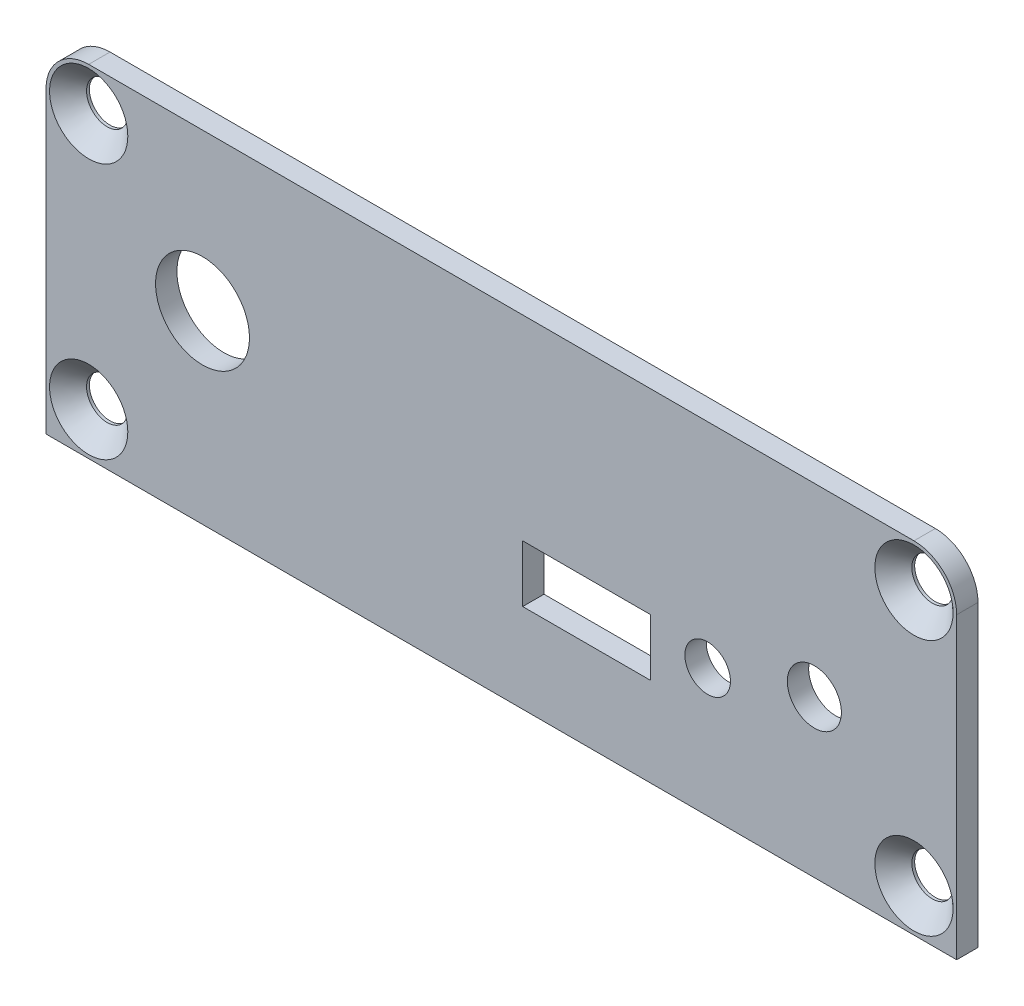
ISO-10303-21;
HEADER;
FILE_DESCRIPTION(('STEP AP214'),'2;1');
FILE_NAME('part.step','',(''),(''),'','','');
FILE_SCHEMA(('AUTOMOTIVE_DESIGN { 1 0 10303 214 1 1 1 1 }'));
ENDSEC;
DATA;
#1=APPLICATION_CONTEXT('core data for automotive mechanical design processes');
#2=APPLICATION_PROTOCOL_DEFINITION('international standard','automotive_design',2000,#1);
#3=PRODUCT_CONTEXT('',#1,'mechanical');
#4=PRODUCT('Part','Part','',(#3));
#5=PRODUCT_RELATED_PRODUCT_CATEGORY('part','',(#4));
#6=PRODUCT_DEFINITION_FORMATION('','',#4);
#7=PRODUCT_DEFINITION_CONTEXT('part definition',#1,'design');
#8=PRODUCT_DEFINITION('design','',#6,#7);
#9=PRODUCT_DEFINITION_SHAPE('','',#8);
#10=(LENGTH_UNIT() NAMED_UNIT(*) SI_UNIT(.MILLI.,.METRE.));
#11=(NAMED_UNIT(*) PLANE_ANGLE_UNIT() SI_UNIT($,.RADIAN.));
#12=(NAMED_UNIT(*) SI_UNIT($,.STERADIAN.) SOLID_ANGLE_UNIT());
#13=UNCERTAINTY_MEASURE_WITH_UNIT(LENGTH_MEASURE(1.E-05),#10,'distance_accuracy_value','');
#14=(GEOMETRIC_REPRESENTATION_CONTEXT(3) GLOBAL_UNCERTAINTY_ASSIGNED_CONTEXT((#13)) GLOBAL_UNIT_ASSIGNED_CONTEXT((#10,
#11,#12)) REPRESENTATION_CONTEXT('',''));
#15=CARTESIAN_POINT('',(0.,0.,0.));
#16=DIRECTION('',(0.,0.,1.));
#17=DIRECTION('',(1.,0.,0.));
#18=AXIS2_PLACEMENT_3D('',#15,#16,#17);
#19=CARTESIAN_POINT('',(32.,12.,-1.5));
#20=DIRECTION('',(1.,0.,0.));
#21=DIRECTION('',(0.,0.,-1.));
#22=AXIS2_PLACEMENT_3D('',#19,#20,#21);
#23=PLANE('',#22);
#24=DIRECTION('',(0.,1.,0.));
#25=VECTOR('',#24,1.);
#26=CARTESIAN_POINT('',(32.,12.,-1.5));
#27=LINE('',#26,#25);
#28=CARTESIAN_POINT('',(32.,-12.,-1.5));
#29=VERTEX_POINT('',#28);
#30=CARTESIAN_POINT('',(32.,9.,-1.5));
#31=VERTEX_POINT('',#30);
#32=EDGE_CURVE('E200',#29,#31,#27,.T.);
#33=ORIENTED_EDGE('',*,*,#32,.T.);
#34=DIRECTION('',(0.,0.,1.));
#35=VECTOR('',#34,1.);
#36=CARTESIAN_POINT('',(32.,9.,-1.5));
#37=LINE('',#36,#35);
#38=CARTESIAN_POINT('',(32.,9.,0.));
#39=VERTEX_POINT('',#38);
#40=EDGE_CURVE('E11',#31,#39,#37,.T.);
#41=ORIENTED_EDGE('',*,*,#40,.T.);
#42=DIRECTION('',(0.,1.,0.));
#43=VECTOR('',#42,1.);
#44=CARTESIAN_POINT('',(32.,12.,0.));
#45=LINE('',#44,#43);
#46=CARTESIAN_POINT('',(32.,-12.,0.));
#47=VERTEX_POINT('',#46);
#48=EDGE_CURVE('E199',#47,#39,#45,.T.);
#49=ORIENTED_EDGE('',*,*,#48,.F.);
#50=DIRECTION('',(0.,0.,1.));
#51=VECTOR('',#50,1.);
#52=CARTESIAN_POINT('',(32.,-12.,-1.5));
#53=LINE('',#52,#51);
#54=EDGE_CURVE('E222',#29,#47,#53,.T.);
#55=ORIENTED_EDGE('',*,*,#54,.F.);
#56=EDGE_LOOP('',(#33,#41,#49,#55));
#57=FACE_BOUND('',#56,.T.);
#58=ADVANCED_FACE('F32',(#57),#23,.T.);
#59=CARTESIAN_POINT('',(-32.,-12.,-1.5));
#60=DIRECTION('',(0.,-1.,0.));
#61=DIRECTION('',(0.,0.,-1.));
#62=AXIS2_PLACEMENT_3D('',#59,#60,#61);
#63=PLANE('',#62);
#64=DIRECTION('',(1.,0.,0.));
#65=VECTOR('',#64,1.);
#66=CARTESIAN_POINT('',(-32.,-12.,0.));
#67=LINE('',#66,#65);
#68=CARTESIAN_POINT('',(-32.,-12.,0.));
#69=VERTEX_POINT('',#68);
#70=EDGE_CURVE('E204',#69,#47,#67,.T.);
#71=ORIENTED_EDGE('',*,*,#70,.F.);
#72=DIRECTION('',(0.,0.,1.));
#73=VECTOR('',#72,1.);
#74=CARTESIAN_POINT('',(-32.,-12.,-1.5));
#75=LINE('',#74,#73);
#76=CARTESIAN_POINT('',(-32.,-12.,-1.5));
#77=VERTEX_POINT('',#76);
#78=EDGE_CURVE('E212',#77,#69,#75,.T.);
#79=ORIENTED_EDGE('',*,*,#78,.F.);
#80=DIRECTION('',(1.,0.,0.));
#81=VECTOR('',#80,1.);
#82=CARTESIAN_POINT('',(-32.,-12.,-1.5));
#83=LINE('',#82,#81);
#84=EDGE_CURVE('E209',#77,#29,#83,.T.);
#85=ORIENTED_EDGE('',*,*,#84,.T.);
#86=ORIENTED_EDGE('',*,*,#54,.T.);
#87=EDGE_LOOP('',(#71,#79,#85,#86));
#88=FACE_BOUND('',#87,.T.);
#89=ADVANCED_FACE('F260',(#88),#63,.T.);
#90=CARTESIAN_POINT('',(-32.,12.,-1.5));
#91=DIRECTION('',(-1.,0.,0.));
#92=DIRECTION('',(0.,0.,1.));
#93=AXIS2_PLACEMENT_3D('',#90,#91,#92);
#94=PLANE('',#93);
#95=DIRECTION('',(0.,-1.,0.));
#96=VECTOR('',#95,1.);
#97=CARTESIAN_POINT('',(-32.,12.,0.));
#98=LINE('',#97,#96);
#99=CARTESIAN_POINT('',(-32.,9.,0.));
#100=VERTEX_POINT('',#99);
#101=EDGE_CURVE('E218',#100,#69,#98,.T.);
#102=ORIENTED_EDGE('',*,*,#101,.F.);
#103=DIRECTION('',(0.,0.,1.));
#104=VECTOR('',#103,1.);
#105=CARTESIAN_POINT('',(-32.,9.,-1.5));
#106=LINE('',#105,#104);
#107=CARTESIAN_POINT('',(-32.,9.,-1.5));
#108=VERTEX_POINT('',#107);
#109=EDGE_CURVE('E235',#100,#108,#106,.F.);
#110=ORIENTED_EDGE('',*,*,#109,.T.);
#111=DIRECTION('',(0.,-1.,0.));
#112=VECTOR('',#111,1.);
#113=CARTESIAN_POINT('',(-32.,12.,-1.5));
#114=LINE('',#113,#112);
#115=EDGE_CURVE('E207',#108,#77,#114,.T.);
#116=ORIENTED_EDGE('',*,*,#115,.T.);
#117=ORIENTED_EDGE('',*,*,#78,.T.);
#118=EDGE_LOOP('',(#102,#110,#116,#117));
#119=FACE_BOUND('',#118,.T.);
#120=ADVANCED_FACE('F256',(#119),#94,.T.);
#121=CARTESIAN_POINT('',(-32.,12.,-1.5));
#122=DIRECTION('',(0.,1.,0.));
#123=DIRECTION('',(0.,0.,1.));
#124=AXIS2_PLACEMENT_3D('',#121,#122,#123);
#125=PLANE('',#124);
#126=DIRECTION('',(-1.,0.,0.));
#127=VECTOR('',#126,1.);
#128=CARTESIAN_POINT('',(-32.,12.,-1.5));
#129=LINE('',#128,#127);
#130=CARTESIAN_POINT('',(29.,12.,-1.5));
#131=VERTEX_POINT('',#130);
#132=CARTESIAN_POINT('',(-29.,12.,-1.5));
#133=VERTEX_POINT('',#132);
#134=EDGE_CURVE('E203',#131,#133,#129,.T.);
#135=ORIENTED_EDGE('',*,*,#134,.T.);
#136=DIRECTION('',(0.,0.,1.));
#137=VECTOR('',#136,1.);
#138=CARTESIAN_POINT('',(-29.,12.,-1.5));
#139=LINE('',#138,#137);
#140=CARTESIAN_POINT('',(-29.,12.,0.));
#141=VERTEX_POINT('',#140);
#142=EDGE_CURVE('E228',#133,#141,#139,.T.);
#143=ORIENTED_EDGE('',*,*,#142,.T.);
#144=DIRECTION('',(-1.,0.,0.));
#145=VECTOR('',#144,1.);
#146=CARTESIAN_POINT('',(-32.,12.,0.));
#147=LINE('',#146,#145);
#148=CARTESIAN_POINT('',(29.,12.,0.));
#149=VERTEX_POINT('',#148);
#150=EDGE_CURVE('E215',#149,#141,#147,.T.);
#151=ORIENTED_EDGE('',*,*,#150,.F.);
#152=DIRECTION('',(0.,0.,1.));
#153=VECTOR('',#152,1.);
#154=CARTESIAN_POINT('',(29.,12.,-1.5));
#155=LINE('',#154,#153);
#156=EDGE_CURVE('E224',#149,#131,#155,.F.);
#157=ORIENTED_EDGE('',*,*,#156,.T.);
#158=EDGE_LOOP('',(#135,#143,#151,#157));
#159=FACE_BOUND('',#158,.T.);
#160=ADVANCED_FACE('F248',(#159),#125,.T.);
#161=CARTESIAN_POINT('',(0.,0.,-1.5));
#162=DIRECTION('',(0.,0.,1.));
#163=DIRECTION('',(1.,0.,0.));
#164=AXIS2_PLACEMENT_3D('',#161,#162,#163);
#165=PLANE('',#164);
#166=DIRECTION('',(1.,0.,0.));
#167=VECTOR('',#166,1.);
#168=CARTESIAN_POINT('',(1.5,-5.75,-1.5));
#169=LINE('',#168,#167);
#170=CARTESIAN_POINT('',(1.5,-5.75,-1.5));
#171=VERTEX_POINT('',#170);
#172=CARTESIAN_POINT('',(10.5,-5.75,-1.5));
#173=VERTEX_POINT('',#172);
#174=EDGE_CURVE('E117',#171,#173,#169,.T.);
#175=ORIENTED_EDGE('',*,*,#174,.T.);
#176=DIRECTION('',(0.,1.,0.));
#177=VECTOR('',#176,1.);
#178=CARTESIAN_POINT('',(10.5,-1.75,-1.5));
#179=LINE('',#178,#177);
#180=CARTESIAN_POINT('',(10.5,-1.75,-1.5));
#181=VERTEX_POINT('',#180);
#182=EDGE_CURVE('E111',#173,#181,#179,.T.);
#183=ORIENTED_EDGE('',*,*,#182,.T.);
#184=DIRECTION('',(-1.,0.,0.));
#185=VECTOR('',#184,1.);
#186=CARTESIAN_POINT('',(1.5,-1.75,-1.5));
#187=LINE('',#186,#185);
#188=CARTESIAN_POINT('',(1.5,-1.75,-1.5));
#189=VERTEX_POINT('',#188);
#190=EDGE_CURVE('E120',#181,#189,#187,.T.);
#191=ORIENTED_EDGE('',*,*,#190,.T.);
#192=DIRECTION('',(0.,-1.,0.));
#193=VECTOR('',#192,1.);
#194=CARTESIAN_POINT('',(1.5,-1.75,-1.5));
#195=LINE('',#194,#193);
#196=EDGE_CURVE('E47',#189,#171,#195,.T.);
#197=ORIENTED_EDGE('',*,*,#196,.T.);
#198=EDGE_LOOP('',(#175,#183,#191,#197));
#199=FACE_BOUND('',#198,.T.);
#200=CARTESIAN_POINT('',(22.,-1.,-1.5));
#201=DIRECTION('',(0.,0.,1.));
#202=DIRECTION('',(1.,0.,0.));
#203=AXIS2_PLACEMENT_3D('',#200,#201,#202);
#204=CIRCLE('',#203,1.9);
#205=CARTESIAN_POINT('',(23.9,-1.,-1.5));
#206=VERTEX_POINT('',#205);
#207=EDGE_CURVE('E146',#206,#206,#204,.T.);
#208=ORIENTED_EDGE('',*,*,#207,.T.);
#209=EDGE_LOOP('',(#208));
#210=FACE_BOUND('',#209,.T.);
#211=CARTESIAN_POINT('',(14.5,-3.,-1.5));
#212=DIRECTION('',(0.,0.,1.));
#213=DIRECTION('',(1.,0.,0.));
#214=AXIS2_PLACEMENT_3D('',#211,#212,#213);
#215=CIRCLE('',#214,1.6);
#216=CARTESIAN_POINT('',(16.1,-3.,-1.5));
#217=VERTEX_POINT('',#216);
#218=EDGE_CURVE('E152',#217,#217,#215,.T.);
#219=ORIENTED_EDGE('',*,*,#218,.T.);
#220=EDGE_LOOP('',(#219));
#221=FACE_BOUND('',#220,.T.);
#222=CARTESIAN_POINT('',(-21.,1.,-1.5));
#223=DIRECTION('',(0.,0.,1.));
#224=DIRECTION('',(1.,0.,0.));
#225=AXIS2_PLACEMENT_3D('',#222,#223,#224);
#226=CIRCLE('',#225,3.3);
#227=CARTESIAN_POINT('',(-17.7,1.,-1.5));
#228=VERTEX_POINT('',#227);
#229=EDGE_CURVE('E158',#228,#228,#226,.T.);
#230=ORIENTED_EDGE('',*,*,#229,.T.);
#231=EDGE_LOOP('',(#230));
#232=FACE_BOUND('',#231,.T.);
#233=CARTESIAN_POINT('',(-29.,9.,-1.5));
#234=DIRECTION('',(0.,0.,1.));
#235=DIRECTION('',(1.,0.,0.));
#236=AXIS2_PLACEMENT_3D('',#233,#234,#235);
#237=CIRCLE('',#236,1.45);
#238=CARTESIAN_POINT('',(-27.55,9.,-1.5));
#239=VERTEX_POINT('',#238);
#240=EDGE_CURVE('E169',#239,#239,#237,.T.);
#241=ORIENTED_EDGE('',*,*,#240,.T.);
#242=EDGE_LOOP('',(#241));
#243=FACE_BOUND('',#242,.T.);
#244=CARTESIAN_POINT('',(29.,9.,-1.5));
#245=DIRECTION('',(0.,0.,1.));
#246=DIRECTION('',(1.,0.,0.));
#247=AXIS2_PLACEMENT_3D('',#244,#245,#246);
#248=CIRCLE('',#247,1.45);
#249=CARTESIAN_POINT('',(30.45,9.,-1.5));
#250=VERTEX_POINT('',#249);
#251=EDGE_CURVE('E178',#250,#250,#248,.T.);
#252=ORIENTED_EDGE('',*,*,#251,.T.);
#253=EDGE_LOOP('',(#252));
#254=FACE_BOUND('',#253,.T.);
#255=CARTESIAN_POINT('',(-29.,-9.,-1.5));
#256=DIRECTION('',(0.,0.,1.));
#257=DIRECTION('',(1.,0.,0.));
#258=AXIS2_PLACEMENT_3D('',#255,#256,#257);
#259=CIRCLE('',#258,1.45);
#260=CARTESIAN_POINT('',(-27.55,-9.,-1.5));
#261=VERTEX_POINT('',#260);
#262=EDGE_CURVE('E187',#261,#261,#259,.T.);
#263=ORIENTED_EDGE('',*,*,#262,.T.);
#264=EDGE_LOOP('',(#263));
#265=FACE_BOUND('',#264,.T.);
#266=CARTESIAN_POINT('',(29.,-9.,-1.5));
#267=DIRECTION('',(0.,0.,1.));
#268=DIRECTION('',(1.,0.,0.));
#269=AXIS2_PLACEMENT_3D('',#266,#267,#268);
#270=CIRCLE('',#269,1.45);
#271=CARTESIAN_POINT('',(30.45,-9.,-1.5));
#272=VERTEX_POINT('',#271);
#273=EDGE_CURVE('E196',#272,#272,#270,.T.);
#274=ORIENTED_EDGE('',*,*,#273,.T.);
#275=EDGE_LOOP('',(#274));
#276=FACE_BOUND('',#275,.T.);
#277=ORIENTED_EDGE('',*,*,#115,.F.);
#278=CARTESIAN_POINT('',(-29.,9.,-1.5));
#279=DIRECTION('',(0.,0.,1.));
#280=DIRECTION('',(1.,0.,0.));
#281=AXIS2_PLACEMENT_3D('',#278,#279,#280);
#282=CIRCLE('',#281,3.);
#283=EDGE_CURVE('E40',#108,#133,#282,.F.);
#284=ORIENTED_EDGE('',*,*,#283,.T.);
#285=ORIENTED_EDGE('',*,*,#134,.F.);
#286=CARTESIAN_POINT('',(29.,9.,-1.5));
#287=DIRECTION('',(0.,0.,1.));
#288=DIRECTION('',(1.,0.,0.));
#289=AXIS2_PLACEMENT_3D('',#286,#287,#288);
#290=CIRCLE('',#289,3.);
#291=EDGE_CURVE('E237',#131,#31,#290,.F.);
#292=ORIENTED_EDGE('',*,*,#291,.T.);
#293=ORIENTED_EDGE('',*,*,#32,.F.);
#294=ORIENTED_EDGE('',*,*,#84,.F.);
#295=EDGE_LOOP('',(#277,#284,#285,#292,#293,#294));
#296=FACE_BOUND('',#295,.T.);
#297=ADVANCED_FACE('F124',(#199,#210,#221,#232,#243,#254,#265,#276,#296),#165,.F.);
#298=CARTESIAN_POINT('',(0.,0.,0.));
#299=DIRECTION('',(0.,0.,1.));
#300=DIRECTION('',(1.,0.,0.));
#301=AXIS2_PLACEMENT_3D('',#298,#299,#300);
#302=PLANE('',#301);
#303=DIRECTION('',(0.,1.,0.));
#304=VECTOR('',#303,1.);
#305=CARTESIAN_POINT('',(10.5,-1.75,0.));
#306=LINE('',#305,#304);
#307=CARTESIAN_POINT('',(10.5,-5.75,0.));
#308=VERTEX_POINT('',#307);
#309=CARTESIAN_POINT('',(10.5,-1.75,0.));
#310=VERTEX_POINT('',#309);
#311=EDGE_CURVE('E55',#308,#310,#306,.T.);
#312=ORIENTED_EDGE('',*,*,#311,.F.);
#313=DIRECTION('',(1.,0.,0.));
#314=VECTOR('',#313,1.);
#315=CARTESIAN_POINT('',(1.5,-5.75,0.));
#316=LINE('',#315,#314);
#317=CARTESIAN_POINT('',(1.5,-5.75,0.));
#318=VERTEX_POINT('',#317);
#319=EDGE_CURVE('E127',#318,#308,#316,.T.);
#320=ORIENTED_EDGE('',*,*,#319,.F.);
#321=DIRECTION('',(0.,-1.,0.));
#322=VECTOR('',#321,1.);
#323=CARTESIAN_POINT('',(1.5,-1.75,0.));
#324=LINE('',#323,#322);
#325=CARTESIAN_POINT('',(1.5,-1.75,0.));
#326=VERTEX_POINT('',#325);
#327=EDGE_CURVE('E130',#326,#318,#324,.T.);
#328=ORIENTED_EDGE('',*,*,#327,.F.);
#329=DIRECTION('',(-1.,0.,0.));
#330=VECTOR('',#329,1.);
#331=CARTESIAN_POINT('',(1.5,-1.75,0.));
#332=LINE('',#331,#330);
#333=EDGE_CURVE('E136',#310,#326,#332,.T.);
#334=ORIENTED_EDGE('',*,*,#333,.F.);
#335=EDGE_LOOP('',(#312,#320,#328,#334));
#336=FACE_BOUND('',#335,.T.);
#337=CARTESIAN_POINT('',(22.,-1.,0.));
#338=DIRECTION('',(0.,0.,1.));
#339=DIRECTION('',(1.,0.,0.));
#340=AXIS2_PLACEMENT_3D('',#337,#338,#339);
#341=CIRCLE('',#340,1.9);
#342=CARTESIAN_POINT('',(23.9,-1.,0.));
#343=VERTEX_POINT('',#342);
#344=EDGE_CURVE('E142',#343,#343,#341,.T.);
#345=ORIENTED_EDGE('',*,*,#344,.F.);
#346=EDGE_LOOP('',(#345));
#347=FACE_BOUND('',#346,.T.);
#348=CARTESIAN_POINT('',(14.5,-3.,0.));
#349=DIRECTION('',(0.,0.,1.));
#350=DIRECTION('',(1.,0.,0.));
#351=AXIS2_PLACEMENT_3D('',#348,#349,#350);
#352=CIRCLE('',#351,1.6);
#353=CARTESIAN_POINT('',(16.1,-3.,0.));
#354=VERTEX_POINT('',#353);
#355=EDGE_CURVE('E149',#354,#354,#352,.T.);
#356=ORIENTED_EDGE('',*,*,#355,.F.);
#357=EDGE_LOOP('',(#356));
#358=FACE_BOUND('',#357,.T.);
#359=CARTESIAN_POINT('',(-21.,1.,0.));
#360=DIRECTION('',(0.,0.,1.));
#361=DIRECTION('',(1.,0.,0.));
#362=AXIS2_PLACEMENT_3D('',#359,#360,#361);
#363=CIRCLE('',#362,3.3);
#364=CARTESIAN_POINT('',(-17.7,1.,0.));
#365=VERTEX_POINT('',#364);
#366=EDGE_CURVE('E155',#365,#365,#363,.T.);
#367=ORIENTED_EDGE('',*,*,#366,.F.);
#368=EDGE_LOOP('',(#367));
#369=FACE_BOUND('',#368,.T.);
#370=CARTESIAN_POINT('',(-29.,9.,0.));
#371=DIRECTION('',(0.,0.,1.));
#372=DIRECTION('',(1.,0.,0.));
#373=AXIS2_PLACEMENT_3D('',#370,#371,#372);
#374=CIRCLE('',#373,2.75);
#375=CARTESIAN_POINT('',(-26.25,9.,0.));
#376=VERTEX_POINT('',#375);
#377=EDGE_CURVE('E161',#376,#376,#374,.T.);
#378=ORIENTED_EDGE('',*,*,#377,.F.);
#379=EDGE_LOOP('',(#378));
#380=FACE_BOUND('',#379,.T.);
#381=CARTESIAN_POINT('',(29.,9.,0.));
#382=DIRECTION('',(0.,0.,1.));
#383=DIRECTION('',(1.,0.,0.));
#384=AXIS2_PLACEMENT_3D('',#381,#382,#383);
#385=CIRCLE('',#384,2.75);
#386=CARTESIAN_POINT('',(31.75,9.,0.));
#387=VERTEX_POINT('',#386);
#388=EDGE_CURVE('E172',#387,#387,#385,.T.);
#389=ORIENTED_EDGE('',*,*,#388,.F.);
#390=EDGE_LOOP('',(#389));
#391=FACE_BOUND('',#390,.T.);
#392=CARTESIAN_POINT('',(-29.,-9.,0.));
#393=DIRECTION('',(0.,0.,1.));
#394=DIRECTION('',(1.,0.,0.));
#395=AXIS2_PLACEMENT_3D('',#392,#393,#394);
#396=CIRCLE('',#395,2.75);
#397=CARTESIAN_POINT('',(-26.25,-9.,0.));
#398=VERTEX_POINT('',#397);
#399=EDGE_CURVE('E181',#398,#398,#396,.T.);
#400=ORIENTED_EDGE('',*,*,#399,.F.);
#401=EDGE_LOOP('',(#400));
#402=FACE_BOUND('',#401,.T.);
#403=CARTESIAN_POINT('',(29.,-9.,0.));
#404=DIRECTION('',(0.,0.,1.));
#405=DIRECTION('',(1.,0.,0.));
#406=AXIS2_PLACEMENT_3D('',#403,#404,#405);
#407=CIRCLE('',#406,2.75);
#408=CARTESIAN_POINT('',(31.75,-9.,0.));
#409=VERTEX_POINT('',#408);
#410=EDGE_CURVE('E190',#409,#409,#407,.T.);
#411=ORIENTED_EDGE('',*,*,#410,.F.);
#412=EDGE_LOOP('',(#411));
#413=FACE_BOUND('',#412,.T.);
#414=ORIENTED_EDGE('',*,*,#150,.T.);
#415=CARTESIAN_POINT('',(-29.,9.,0.));
#416=DIRECTION('',(0.,0.,1.));
#417=DIRECTION('',(1.,0.,0.));
#418=AXIS2_PLACEMENT_3D('',#415,#416,#417);
#419=CIRCLE('',#418,3.);
#420=EDGE_CURVE('E233',#141,#100,#419,.T.);
#421=ORIENTED_EDGE('',*,*,#420,.T.);
#422=ORIENTED_EDGE('',*,*,#101,.T.);
#423=ORIENTED_EDGE('',*,*,#70,.T.);
#424=ORIENTED_EDGE('',*,*,#48,.T.);
#425=CARTESIAN_POINT('',(29.,9.,0.));
#426=DIRECTION('',(0.,0.,1.));
#427=DIRECTION('',(1.,0.,0.));
#428=AXIS2_PLACEMENT_3D('',#425,#426,#427);
#429=CIRCLE('',#428,3.);
#430=EDGE_CURVE('E231',#39,#149,#429,.T.);
#431=ORIENTED_EDGE('',*,*,#430,.T.);
#432=EDGE_LOOP('',(#414,#421,#422,#423,#424,#431));
#433=FACE_BOUND('',#432,.T.);
#434=ADVANCED_FACE('F254',(#336,#347,#358,#369,#380,#391,#402,#413,#433),#302,.T.);
#435=CARTESIAN_POINT('',(29.,-9.,0.));
#436=DIRECTION('',(0.,0.,1.));
#437=DIRECTION('',(1.,0.,0.));
#438=AXIS2_PLACEMENT_3D('',#435,#436,#437);
#439=CYLINDRICAL_SURFACE('',#438,1.44999999999999);
#440=ORIENTED_EDGE('',*,*,#273,.F.);
#441=EDGE_LOOP('',(#440));
#442=FACE_BOUND('',#441,.T.);
#443=CARTESIAN_POINT('',(29.,-9.,-1.30000000000001));
#444=DIRECTION('',(0.,0.,1.));
#445=DIRECTION('',(1.,0.,0.));
#446=AXIS2_PLACEMENT_3D('',#443,#444,#445);
#447=CIRCLE('',#446,1.44999999999999);
#448=CARTESIAN_POINT('',(30.45,-9.,-1.30000000000001));
#449=VERTEX_POINT('',#448);
#450=EDGE_CURVE('E193',#449,#449,#447,.T.);
#451=ORIENTED_EDGE('',*,*,#450,.T.);
#452=EDGE_LOOP('',(#451));
#453=FACE_BOUND('',#452,.T.);
#454=ADVANCED_FACE('F289',(#442,#453),#439,.F.);
#455=CARTESIAN_POINT('',(29.,-9.,0.));
#456=DIRECTION('',(0.,0.,1.));
#457=DIRECTION('',(1.,0.,0.));
#458=AXIS2_PLACEMENT_3D('',#455,#456,#457);
#459=CONICAL_SURFACE('',#458,2.75,0.785398163397448);
#460=ORIENTED_EDGE('',*,*,#450,.F.);
#461=EDGE_LOOP('',(#460));
#462=FACE_BOUND('',#461,.T.);
#463=ORIENTED_EDGE('',*,*,#410,.T.);
#464=EDGE_LOOP('',(#463));
#465=FACE_BOUND('',#464,.T.);
#466=ADVANCED_FACE('F295',(#462,#465),#459,.F.);
#467=CARTESIAN_POINT('',(-29.,-9.,0.));
#468=DIRECTION('',(0.,0.,1.));
#469=DIRECTION('',(1.,0.,0.));
#470=AXIS2_PLACEMENT_3D('',#467,#468,#469);
#471=CYLINDRICAL_SURFACE('',#470,1.44999999999999);
#472=ORIENTED_EDGE('',*,*,#262,.F.);
#473=EDGE_LOOP('',(#472));
#474=FACE_BOUND('',#473,.T.);
#475=CARTESIAN_POINT('',(-29.,-9.,-1.30000000000001));
#476=DIRECTION('',(0.,0.,1.));
#477=DIRECTION('',(1.,0.,0.));
#478=AXIS2_PLACEMENT_3D('',#475,#476,#477);
#479=CIRCLE('',#478,1.44999999999999);
#480=CARTESIAN_POINT('',(-27.55,-9.,-1.30000000000001));
#481=VERTEX_POINT('',#480);
#482=EDGE_CURVE('E184',#481,#481,#479,.T.);
#483=ORIENTED_EDGE('',*,*,#482,.T.);
#484=EDGE_LOOP('',(#483));
#485=FACE_BOUND('',#484,.T.);
#486=ADVANCED_FACE('F299',(#474,#485),#471,.F.);
#487=CARTESIAN_POINT('',(-29.,-9.,0.));
#488=DIRECTION('',(0.,0.,1.));
#489=DIRECTION('',(1.,0.,0.));
#490=AXIS2_PLACEMENT_3D('',#487,#488,#489);
#491=CONICAL_SURFACE('',#490,2.75,0.785398163397449);
#492=ORIENTED_EDGE('',*,*,#482,.F.);
#493=EDGE_LOOP('',(#492));
#494=FACE_BOUND('',#493,.T.);
#495=ORIENTED_EDGE('',*,*,#399,.T.);
#496=EDGE_LOOP('',(#495));
#497=FACE_BOUND('',#496,.T.);
#498=ADVANCED_FACE('F303',(#494,#497),#491,.F.);
#499=CARTESIAN_POINT('',(29.,9.,0.));
#500=DIRECTION('',(0.,0.,1.));
#501=DIRECTION('',(1.,0.,0.));
#502=AXIS2_PLACEMENT_3D('',#499,#500,#501);
#503=CYLINDRICAL_SURFACE('',#502,1.44999999999999);
#504=ORIENTED_EDGE('',*,*,#251,.F.);
#505=EDGE_LOOP('',(#504));
#506=FACE_BOUND('',#505,.T.);
#507=CARTESIAN_POINT('',(29.,9.,-1.30000000000001));
#508=DIRECTION('',(0.,0.,1.));
#509=DIRECTION('',(1.,0.,0.));
#510=AXIS2_PLACEMENT_3D('',#507,#508,#509);
#511=CIRCLE('',#510,1.44999999999999);
#512=CARTESIAN_POINT('',(30.45,9.,-1.30000000000001));
#513=VERTEX_POINT('',#512);
#514=EDGE_CURVE('E175',#513,#513,#511,.T.);
#515=ORIENTED_EDGE('',*,*,#514,.T.);
#516=EDGE_LOOP('',(#515));
#517=FACE_BOUND('',#516,.T.);
#518=ADVANCED_FACE('F307',(#506,#517),#503,.F.);
#519=CARTESIAN_POINT('',(29.,9.,0.));
#520=DIRECTION('',(0.,0.,1.));
#521=DIRECTION('',(1.,0.,0.));
#522=AXIS2_PLACEMENT_3D('',#519,#520,#521);
#523=CONICAL_SURFACE('',#522,2.75,0.785398163397448);
#524=ORIENTED_EDGE('',*,*,#514,.F.);
#525=EDGE_LOOP('',(#524));
#526=FACE_BOUND('',#525,.T.);
#527=ORIENTED_EDGE('',*,*,#388,.T.);
#528=EDGE_LOOP('',(#527));
#529=FACE_BOUND('',#528,.T.);
#530=ADVANCED_FACE('F311',(#526,#529),#523,.F.);
#531=CARTESIAN_POINT('',(-29.,9.,0.));
#532=DIRECTION('',(0.,0.,1.));
#533=DIRECTION('',(1.,0.,0.));
#534=AXIS2_PLACEMENT_3D('',#531,#532,#533);
#535=CYLINDRICAL_SURFACE('',#534,1.44999999999999);
#536=ORIENTED_EDGE('',*,*,#240,.F.);
#537=EDGE_LOOP('',(#536));
#538=FACE_BOUND('',#537,.T.);
#539=CARTESIAN_POINT('',(-29.,9.,-1.30000000000001));
#540=DIRECTION('',(0.,0.,1.));
#541=DIRECTION('',(1.,0.,0.));
#542=AXIS2_PLACEMENT_3D('',#539,#540,#541);
#543=CIRCLE('',#542,1.44999999999999);
#544=CARTESIAN_POINT('',(-27.55,9.,-1.30000000000001));
#545=VERTEX_POINT('',#544);
#546=EDGE_CURVE('E166',#545,#545,#543,.T.);
#547=ORIENTED_EDGE('',*,*,#546,.T.);
#548=EDGE_LOOP('',(#547));
#549=FACE_BOUND('',#548,.T.);
#550=ADVANCED_FACE('F315',(#538,#549),#535,.F.);
#551=CARTESIAN_POINT('',(-29.,9.,0.));
#552=DIRECTION('',(0.,0.,1.));
#553=DIRECTION('',(1.,0.,0.));
#554=AXIS2_PLACEMENT_3D('',#551,#552,#553);
#555=CONICAL_SURFACE('',#554,2.75,0.785398163397449);
#556=ORIENTED_EDGE('',*,*,#546,.F.);
#557=EDGE_LOOP('',(#556));
#558=FACE_BOUND('',#557,.T.);
#559=ORIENTED_EDGE('',*,*,#377,.T.);
#560=EDGE_LOOP('',(#559));
#561=FACE_BOUND('',#560,.T.);
#562=ADVANCED_FACE('F275',(#558,#561),#555,.F.);
#563=CARTESIAN_POINT('',(-29.,9.,-1.5));
#564=DIRECTION('',(0.,0.,1.));
#565=DIRECTION('',(1.,0.,0.));
#566=AXIS2_PLACEMENT_3D('',#563,#564,#565);
#567=CYLINDRICAL_SURFACE('',#566,3.);
#568=ORIENTED_EDGE('',*,*,#283,.F.);
#569=ORIENTED_EDGE('',*,*,#109,.F.);
#570=ORIENTED_EDGE('',*,*,#420,.F.);
#571=ORIENTED_EDGE('',*,*,#142,.F.);
#572=EDGE_LOOP('',(#568,#569,#570,#571));
#573=FACE_BOUND('',#572,.T.);
#574=ADVANCED_FACE('F251',(#573),#567,.T.);
#575=CARTESIAN_POINT('',(29.,9.,-1.5));
#576=DIRECTION('',(0.,0.,1.));
#577=DIRECTION('',(1.,0.,0.));
#578=AXIS2_PLACEMENT_3D('',#575,#576,#577);
#579=CYLINDRICAL_SURFACE('',#578,3.);
#580=ORIENTED_EDGE('',*,*,#291,.F.);
#581=ORIENTED_EDGE('',*,*,#156,.F.);
#582=ORIENTED_EDGE('',*,*,#430,.F.);
#583=ORIENTED_EDGE('',*,*,#40,.F.);
#584=EDGE_LOOP('',(#580,#581,#582,#583));
#585=FACE_BOUND('',#584,.T.);
#586=ADVANCED_FACE('F34',(#585),#579,.T.);
#587=CARTESIAN_POINT('',(-21.,1.,-1.5));
#588=DIRECTION('',(0.,0.,1.));
#589=DIRECTION('',(1.,0.,0.));
#590=AXIS2_PLACEMENT_3D('',#587,#588,#589);
#591=CYLINDRICAL_SURFACE('',#590,3.3);
#592=ORIENTED_EDGE('',*,*,#229,.F.);
#593=EDGE_LOOP('',(#592));
#594=FACE_BOUND('',#593,.T.);
#595=ORIENTED_EDGE('',*,*,#366,.T.);
#596=EDGE_LOOP('',(#595));
#597=FACE_BOUND('',#596,.T.);
#598=ADVANCED_FACE('F267',(#594,#597),#591,.F.);
#599=CARTESIAN_POINT('',(14.5,-3.,-1.5));
#600=DIRECTION('',(0.,0.,1.));
#601=DIRECTION('',(1.,0.,0.));
#602=AXIS2_PLACEMENT_3D('',#599,#600,#601);
#603=CYLINDRICAL_SURFACE('',#602,1.6);
#604=ORIENTED_EDGE('',*,*,#218,.F.);
#605=EDGE_LOOP('',(#604));
#606=FACE_BOUND('',#605,.T.);
#607=ORIENTED_EDGE('',*,*,#355,.T.);
#608=EDGE_LOOP('',(#607));
#609=FACE_BOUND('',#608,.T.);
#610=ADVANCED_FACE('F272',(#606,#609),#603,.F.);
#611=CARTESIAN_POINT('',(22.,-1.,-1.5));
#612=DIRECTION('',(0.,0.,1.));
#613=DIRECTION('',(1.,0.,0.));
#614=AXIS2_PLACEMENT_3D('',#611,#612,#613);
#615=CYLINDRICAL_SURFACE('',#614,1.9);
#616=ORIENTED_EDGE('',*,*,#207,.F.);
#617=EDGE_LOOP('',(#616));
#618=FACE_BOUND('',#617,.T.);
#619=ORIENTED_EDGE('',*,*,#344,.T.);
#620=EDGE_LOOP('',(#619));
#621=FACE_BOUND('',#620,.T.);
#622=ADVANCED_FACE('F325',(#618,#621),#615,.F.);
#623=CARTESIAN_POINT('',(10.5,-1.75,-1.5));
#624=DIRECTION('',(1.,0.,0.));
#625=DIRECTION('',(0.,0.,-1.));
#626=AXIS2_PLACEMENT_3D('',#623,#624,#625);
#627=PLANE('',#626);
#628=ORIENTED_EDGE('',*,*,#311,.T.);
#629=DIRECTION('',(0.,0.,1.));
#630=VECTOR('',#629,1.);
#631=CARTESIAN_POINT('',(10.5,-1.75,-1.5));
#632=LINE('',#631,#630);
#633=EDGE_CURVE('E107',#181,#310,#632,.T.);
#634=ORIENTED_EDGE('',*,*,#633,.F.);
#635=ORIENTED_EDGE('',*,*,#182,.F.);
#636=DIRECTION('',(0.,0.,1.));
#637=VECTOR('',#636,1.);
#638=CARTESIAN_POINT('',(10.5,-5.75,-1.5));
#639=LINE('',#638,#637);
#640=EDGE_CURVE('E140',#173,#308,#639,.T.);
#641=ORIENTED_EDGE('',*,*,#640,.T.);
#642=EDGE_LOOP('',(#628,#634,#635,#641));
#643=FACE_BOUND('',#642,.T.);
#644=ADVANCED_FACE('F109',(#643),#627,.F.);
#645=CARTESIAN_POINT('',(1.5,-5.75,-1.5));
#646=DIRECTION('',(0.,-1.,0.));
#647=DIRECTION('',(0.,0.,-1.));
#648=AXIS2_PLACEMENT_3D('',#645,#646,#647);
#649=PLANE('',#648);
#650=ORIENTED_EDGE('',*,*,#319,.T.);
#651=ORIENTED_EDGE('',*,*,#640,.F.);
#652=ORIENTED_EDGE('',*,*,#174,.F.);
#653=DIRECTION('',(0.,0.,1.));
#654=VECTOR('',#653,1.);
#655=CARTESIAN_POINT('',(1.5,-5.75,-1.5));
#656=LINE('',#655,#654);
#657=EDGE_CURVE('E143',#171,#318,#656,.T.);
#658=ORIENTED_EDGE('',*,*,#657,.T.);
#659=EDGE_LOOP('',(#650,#651,#652,#658));
#660=FACE_BOUND('',#659,.T.);
#661=ADVANCED_FACE('F332',(#660),#649,.F.);
#662=CARTESIAN_POINT('',(1.5,-1.75,-1.5));
#663=DIRECTION('',(-1.,0.,0.));
#664=DIRECTION('',(0.,-1.,0.));
#665=AXIS2_PLACEMENT_3D('',#662,#663,#664);
#666=PLANE('',#665);
#667=ORIENTED_EDGE('',*,*,#327,.T.);
#668=ORIENTED_EDGE('',*,*,#657,.F.);
#669=ORIENTED_EDGE('',*,*,#196,.F.);
#670=DIRECTION('',(0.,0.,1.));
#671=VECTOR('',#670,1.);
#672=CARTESIAN_POINT('',(1.5,-1.75,-1.5));
#673=LINE('',#672,#671);
#674=EDGE_CURVE('E116',#189,#326,#673,.T.);
#675=ORIENTED_EDGE('',*,*,#674,.T.);
#676=EDGE_LOOP('',(#667,#668,#669,#675));
#677=FACE_BOUND('',#676,.T.);
#678=ADVANCED_FACE('F335',(#677),#666,.F.);
#679=CARTESIAN_POINT('',(1.5,-1.75,-1.5));
#680=DIRECTION('',(0.,1.,0.));
#681=DIRECTION('',(0.,0.,1.));
#682=AXIS2_PLACEMENT_3D('',#679,#680,#681);
#683=PLANE('',#682);
#684=ORIENTED_EDGE('',*,*,#333,.T.);
#685=ORIENTED_EDGE('',*,*,#674,.F.);
#686=ORIENTED_EDGE('',*,*,#190,.F.);
#687=ORIENTED_EDGE('',*,*,#633,.T.);
#688=EDGE_LOOP('',(#684,#685,#686,#687));
#689=FACE_BOUND('',#688,.T.);
#690=ADVANCED_FACE('F121',(#689),#683,.F.);
#691=CLOSED_SHELL('',(#58,#89,#120,#160,#297,#434,#454,#466,#486,#498,#518,#530,#550,#562,#574,
#586,#598,#610,#622,#644,#661,#678,#690));
#692=MANIFOLD_SOLID_BREP('B2',#691);
#693=ADVANCED_BREP_SHAPE_REPRESENTATION('',(#18,#692),#14);
#694=SHAPE_DEFINITION_REPRESENTATION(#9,#693);
ENDSEC;
END-ISO-10303-21;
